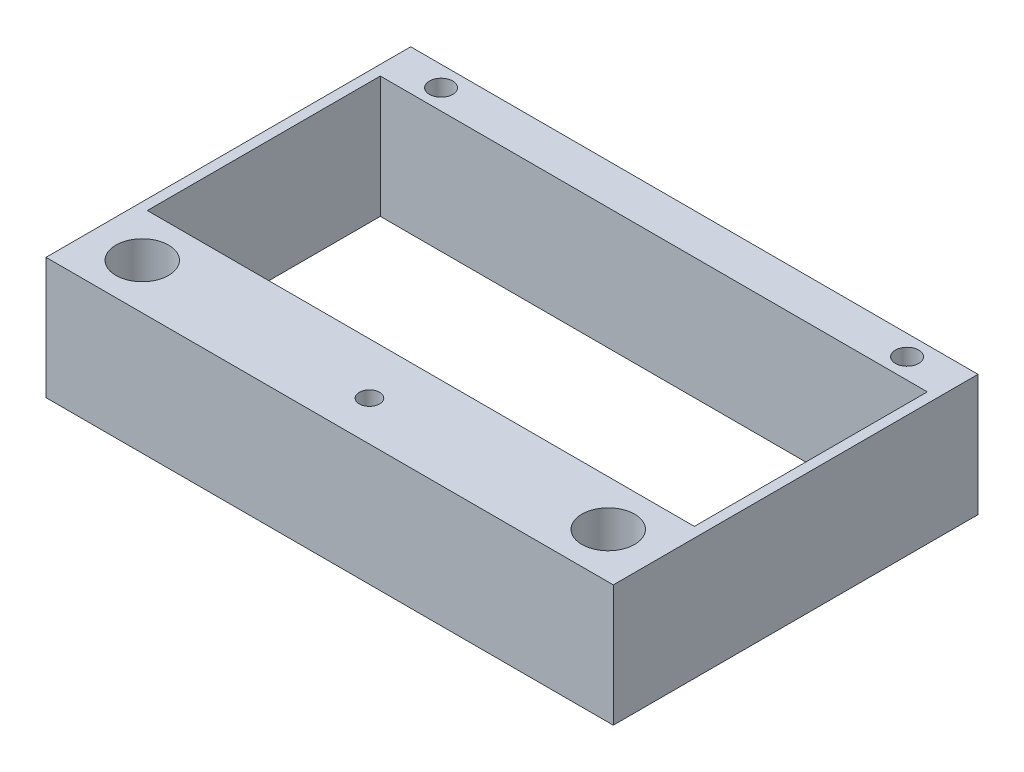
ISO-10303-21;
HEADER;
FILE_DESCRIPTION(('STEP AP214'),'2;1');
FILE_NAME('part.step','',(''),(''),'','','');
FILE_SCHEMA(('AUTOMOTIVE_DESIGN { 1 0 10303 214 1 1 1 1 }'));
ENDSEC;
DATA;
#1=APPLICATION_CONTEXT('core data for automotive mechanical design processes');
#2=APPLICATION_PROTOCOL_DEFINITION('international standard','automotive_design',2000,#1);
#3=PRODUCT_CONTEXT('',#1,'mechanical');
#4=PRODUCT('Part','Part','',(#3));
#5=PRODUCT_RELATED_PRODUCT_CATEGORY('part','',(#4));
#6=PRODUCT_DEFINITION_FORMATION('','',#4);
#7=PRODUCT_DEFINITION_CONTEXT('part definition',#1,'design');
#8=PRODUCT_DEFINITION('design','',#6,#7);
#9=PRODUCT_DEFINITION_SHAPE('','',#8);
#10=(LENGTH_UNIT() NAMED_UNIT(*) SI_UNIT(.MILLI.,.METRE.));
#11=(NAMED_UNIT(*) PLANE_ANGLE_UNIT() SI_UNIT($,.RADIAN.));
#12=(NAMED_UNIT(*) SI_UNIT($,.STERADIAN.) SOLID_ANGLE_UNIT());
#13=UNCERTAINTY_MEASURE_WITH_UNIT(LENGTH_MEASURE(1.E-05),#10,'distance_accuracy_value','');
#14=(GEOMETRIC_REPRESENTATION_CONTEXT(3) GLOBAL_UNCERTAINTY_ASSIGNED_CONTEXT((#13)) GLOBAL_UNIT_ASSIGNED_CONTEXT((#10,
#11,#12)) REPRESENTATION_CONTEXT('',''));
#15=CARTESIAN_POINT('',(0.,0.,0.));
#16=DIRECTION('',(0.,0.,1.));
#17=DIRECTION('',(1.,0.,0.));
#18=AXIS2_PLACEMENT_3D('',#15,#16,#17);
#19=CARTESIAN_POINT('',(0.,12.,0.));
#20=DIRECTION('',(0.,-1.,0.));
#21=DIRECTION('',(0.,0.,-1.));
#22=AXIS2_PLACEMENT_3D('',#19,#20,#21);
#23=PLANE('',#22);
#24=CARTESIAN_POINT('',(17.2743362831858,12.,19.1429731739301));
#25=DIRECTION('',(0.,1.,0.));
#26=DIRECTION('',(0.,0.,1.));
#27=AXIS2_PLACEMENT_3D('',#24,#25,#26);
#28=CIRCLE('',#27,1.);
#29=CARTESIAN_POINT('',(17.2743362831858,12.,20.1429731739301));
#30=VERTEX_POINT('',#29);
#31=EDGE_CURVE('E475',#30,#30,#28,.T.);
#32=ORIENTED_EDGE('',*,*,#31,.F.);
#33=EDGE_LOOP('',(#32));
#34=FACE_BOUND('',#33,.T.);
#35=CARTESIAN_POINT('',(40.2743362831859,12.,-10.929203539823));
#36=DIRECTION('',(0.,1.,0.));
#37=DIRECTION('',(0.,0.,1.));
#38=AXIS2_PLACEMENT_3D('',#35,#36,#37);
#39=CIRCLE('',#38,1.15);
#40=CARTESIAN_POINT('',(40.2743362831859,12.,-9.77920353982301));
#41=VERTEX_POINT('',#40);
#42=EDGE_CURVE('E449',#41,#41,#39,.T.);
#43=ORIENTED_EDGE('',*,*,#42,.F.);
#44=EDGE_LOOP('',(#43));
#45=FACE_BOUND('',#44,.T.);
#46=CARTESIAN_POINT('',(-5.72566371681537,12.,18.570796460177));
#47=DIRECTION('',(0.,1.,0.));
#48=DIRECTION('',(0.,0.,1.));
#49=AXIS2_PLACEMENT_3D('',#46,#47,#48);
#50=CIRCLE('',#49,2.6);
#51=CARTESIAN_POINT('',(-5.72566371681537,12.,21.170796460177));
#52=VERTEX_POINT('',#51);
#53=EDGE_CURVE('E460',#52,#52,#50,.T.);
#54=ORIENTED_EDGE('',*,*,#53,.F.);
#55=EDGE_LOOP('',(#54));
#56=FACE_BOUND('',#55,.T.);
#57=CARTESIAN_POINT('',(40.2743362831808,12.,18.570796460177));
#58=DIRECTION('',(0.,1.,0.));
#59=DIRECTION('',(0.,0.,1.));
#60=AXIS2_PLACEMENT_3D('',#57,#58,#59);
#61=CIRCLE('',#60,2.6);
#62=CARTESIAN_POINT('',(40.2743362831808,12.,21.170796460177));
#63=VERTEX_POINT('',#62);
#64=EDGE_CURVE('E461',#63,#63,#61,.T.);
#65=ORIENTED_EDGE('',*,*,#64,.F.);
#66=EDGE_LOOP('',(#65));
#67=FACE_BOUND('',#66,.T.);
#68=CARTESIAN_POINT('',(-5.72566371681414,12.,-10.929203539823));
#69=DIRECTION('',(0.,1.,0.));
#70=DIRECTION('',(0.,0.,1.));
#71=AXIS2_PLACEMENT_3D('',#68,#69,#70);
#72=CIRCLE('',#71,1.15);
#73=CARTESIAN_POINT('',(-5.72566371681414,12.,-9.77920353982301));
#74=VERTEX_POINT('',#73);
#75=EDGE_CURVE('E446',#74,#74,#72,.T.);
#76=ORIENTED_EDGE('',*,*,#75,.F.);
#77=EDGE_LOOP('',(#76));
#78=FACE_BOUND('',#77,.T.);
#79=DIRECTION('',(0.,0.,1.));
#80=VECTOR('',#79,1.);
#81=CARTESIAN_POINT('',(-10.7256637168141,12.,-1.92920353982301));
#82=LINE('',#81,#80);
#83=CARTESIAN_POINT('',(-10.7256637168141,12.,-12.929203539823));
#84=VERTEX_POINT('',#83);
#85=CARTESIAN_POINT('',(-10.7256637168142,12.,23.070796460177));
#86=VERTEX_POINT('',#85);
#87=EDGE_CURVE('E52',#84,#86,#82,.T.);
#88=ORIENTED_EDGE('',*,*,#87,.T.);
#89=DIRECTION('',(1.,0.,0.));
#90=VECTOR('',#89,1.);
#91=CARTESIAN_POINT('',(-10.7256637168142,12.,23.070796460177));
#92=LINE('',#91,#90);
#93=CARTESIAN_POINT('',(45.2743362831859,12.,23.070796460177));
#94=VERTEX_POINT('',#93);
#95=EDGE_CURVE('E132',#86,#94,#92,.T.);
#96=ORIENTED_EDGE('',*,*,#95,.T.);
#97=DIRECTION('',(0.,0.,-1.));
#98=VECTOR('',#97,1.);
#99=CARTESIAN_POINT('',(45.2743362831859,12.,-9.92920353982301));
#100=LINE('',#99,#98);
#101=CARTESIAN_POINT('',(45.2743362831859,12.,-12.929203539823));
#102=VERTEX_POINT('',#101);
#103=EDGE_CURVE('E11',#94,#102,#100,.T.);
#104=ORIENTED_EDGE('',*,*,#103,.T.);
#105=DIRECTION('',(-1.,0.,0.));
#106=VECTOR('',#105,1.);
#107=CARTESIAN_POINT('',(-10.7256637168141,12.,-12.929203539823));
#108=LINE('',#107,#106);
#109=EDGE_CURVE('E146',#102,#84,#108,.T.);
#110=ORIENTED_EDGE('',*,*,#109,.T.);
#111=EDGE_LOOP('',(#88,#96,#104,#110));
#112=FACE_BOUND('',#111,.T.);
#113=DIRECTION('',(1.,0.,0.));
#114=VECTOR('',#113,1.);
#115=CARTESIAN_POINT('',(-9.72566371681414,12.,14.070796460177));
#116=LINE('',#115,#114);
#117=CARTESIAN_POINT('',(-9.72566371681414,12.,14.070796460177));
#118=VERTEX_POINT('',#117);
#119=CARTESIAN_POINT('',(44.2743362831859,12.,14.070796460177));
#120=VERTEX_POINT('',#119);
#121=EDGE_CURVE('E159',#118,#120,#116,.T.);
#122=ORIENTED_EDGE('',*,*,#121,.F.);
#123=DIRECTION('',(0.,0.,1.));
#124=VECTOR('',#123,1.);
#125=CARTESIAN_POINT('',(-9.72566371681415,12.,-8.92920353982301));
#126=LINE('',#125,#124);
#127=CARTESIAN_POINT('',(-9.72566371681418,12.,-8.92920353982301));
#128=VERTEX_POINT('',#127);
#129=EDGE_CURVE('E169',#128,#118,#126,.T.);
#130=ORIENTED_EDGE('',*,*,#129,.F.);
#131=DIRECTION('',(-1.,0.,0.));
#132=VECTOR('',#131,1.);
#133=CARTESIAN_POINT('',(44.2743362831858,12.,-8.92920353982301));
#134=LINE('',#133,#132);
#135=CARTESIAN_POINT('',(44.2743362831858,12.,-8.92920353982301));
#136=VERTEX_POINT('',#135);
#137=EDGE_CURVE('E166',#136,#128,#134,.T.);
#138=ORIENTED_EDGE('',*,*,#137,.F.);
#139=DIRECTION('',(0.,0.,-1.));
#140=VECTOR('',#139,1.);
#141=CARTESIAN_POINT('',(44.2743362831859,12.,14.070796460177));
#142=LINE('',#141,#140);
#143=EDGE_CURVE('E162',#120,#136,#142,.T.);
#144=ORIENTED_EDGE('',*,*,#143,.F.);
#145=EDGE_LOOP('',(#122,#130,#138,#144));
#146=FACE_BOUND('',#145,.T.);
#147=ADVANCED_FACE('F42',(#34,#45,#56,#67,#78,#112,#146),#23,.F.);
#148=CARTESIAN_POINT('',(0.,0.,0.));
#149=DIRECTION('',(0.,-1.,0.));
#150=DIRECTION('',(0.,0.,-1.));
#151=AXIS2_PLACEMENT_3D('',#148,#149,#150);
#152=PLANE('',#151);
#153=CARTESIAN_POINT('',(40.2743362831859,0.,-10.929203539823));
#154=DIRECTION('',(0.,1.,0.));
#155=DIRECTION('',(0.,0.,1.));
#156=AXIS2_PLACEMENT_3D('',#153,#154,#155);
#157=CIRCLE('',#156,1.15);
#158=CARTESIAN_POINT('',(40.2743362831859,0.,-9.77920353982301));
#159=VERTEX_POINT('',#158);
#160=EDGE_CURVE('E454',#159,#159,#157,.T.);
#161=ORIENTED_EDGE('',*,*,#160,.T.);
#162=EDGE_LOOP('',(#161));
#163=FACE_BOUND('',#162,.T.);
#164=CARTESIAN_POINT('',(-5.72566371681537,0.,18.570796460177));
#165=DIRECTION('',(0.,1.,0.));
#166=DIRECTION('',(0.,0.,1.));
#167=AXIS2_PLACEMENT_3D('',#164,#165,#166);
#168=CIRCLE('',#167,2.6);
#169=CARTESIAN_POINT('',(-5.72566371681537,0.,21.170796460177));
#170=VERTEX_POINT('',#169);
#171=EDGE_CURVE('E457',#170,#170,#168,.T.);
#172=ORIENTED_EDGE('',*,*,#171,.T.);
#173=EDGE_LOOP('',(#172));
#174=FACE_BOUND('',#173,.T.);
#175=CARTESIAN_POINT('',(40.2743362831808,0.,18.570796460177));
#176=DIRECTION('',(0.,1.,0.));
#177=DIRECTION('',(0.,0.,1.));
#178=AXIS2_PLACEMENT_3D('',#175,#176,#177);
#179=CIRCLE('',#178,2.6);
#180=CARTESIAN_POINT('',(40.2743362831808,0.,21.170796460177));
#181=VERTEX_POINT('',#180);
#182=EDGE_CURVE('E468',#181,#181,#179,.T.);
#183=ORIENTED_EDGE('',*,*,#182,.T.);
#184=EDGE_LOOP('',(#183));
#185=FACE_BOUND('',#184,.T.);
#186=CARTESIAN_POINT('',(-5.72566371681414,0.,-10.929203539823));
#187=DIRECTION('',(0.,1.,0.));
#188=DIRECTION('',(0.,0.,1.));
#189=AXIS2_PLACEMENT_3D('',#186,#187,#188);
#190=CIRCLE('',#189,1.15);
#191=CARTESIAN_POINT('',(-5.72566371681414,0.,-9.77920353982301));
#192=VERTEX_POINT('',#191);
#193=EDGE_CURVE('E142',#192,#192,#190,.T.);
#194=ORIENTED_EDGE('',*,*,#193,.T.);
#195=EDGE_LOOP('',(#194));
#196=FACE_BOUND('',#195,.T.);
#197=DIRECTION('',(0.,0.,1.));
#198=VECTOR('',#197,1.);
#199=CARTESIAN_POINT('',(-10.7256637168142,0.,22.070796460177));
#200=LINE('',#199,#198);
#201=CARTESIAN_POINT('',(-10.7256637168141,0.,-12.929203539823));
#202=VERTEX_POINT('',#201);
#203=CARTESIAN_POINT('',(-10.7256637168142,0.,23.070796460177));
#204=VERTEX_POINT('',#203);
#205=EDGE_CURVE('E123',#202,#204,#200,.T.);
#206=ORIENTED_EDGE('',*,*,#205,.F.);
#207=DIRECTION('',(-1.,0.,0.));
#208=VECTOR('',#207,1.);
#209=CARTESIAN_POINT('',(-10.7256637168141,0.,-12.929203539823));
#210=LINE('',#209,#208);
#211=CARTESIAN_POINT('',(45.2743362831859,0.,-12.929203539823));
#212=VERTEX_POINT('',#211);
#213=EDGE_CURVE('E117',#212,#202,#210,.T.);
#214=ORIENTED_EDGE('',*,*,#213,.F.);
#215=DIRECTION('',(0.,0.,-1.));
#216=VECTOR('',#215,1.);
#217=CARTESIAN_POINT('',(45.2743362831859,0.,-9.92920353982301));
#218=LINE('',#217,#216);
#219=CARTESIAN_POINT('',(45.2743362831859,0.,23.070796460177));
#220=VERTEX_POINT('',#219);
#221=EDGE_CURVE('E46',#220,#212,#218,.T.);
#222=ORIENTED_EDGE('',*,*,#221,.F.);
#223=DIRECTION('',(1.,0.,0.));
#224=VECTOR('',#223,1.);
#225=CARTESIAN_POINT('',(-10.7256637168142,0.,23.070796460177));
#226=LINE('',#225,#224);
#227=EDGE_CURVE('E114',#204,#220,#226,.T.);
#228=ORIENTED_EDGE('',*,*,#227,.F.);
#229=EDGE_LOOP('',(#206,#214,#222,#228));
#230=FACE_BOUND('',#229,.T.);
#231=DIRECTION('',(0.,0.,1.));
#232=VECTOR('',#231,1.);
#233=CARTESIAN_POINT('',(-9.72566371681415,0.,7.070796460177));
#234=LINE('',#233,#232);
#235=CARTESIAN_POINT('',(-9.72566371681415,0.,-8.92920353982301));
#236=VERTEX_POINT('',#235);
#237=CARTESIAN_POINT('',(-9.72566371681414,0.,14.070796460177));
#238=VERTEX_POINT('',#237);
#239=EDGE_CURVE('E163',#236,#238,#234,.T.);
#240=ORIENTED_EDGE('',*,*,#239,.T.);
#241=DIRECTION('',(1.,0.,0.));
#242=VECTOR('',#241,1.);
#243=CARTESIAN_POINT('',(-9.72566371681414,0.,14.070796460177));
#244=LINE('',#243,#242);
#245=CARTESIAN_POINT('',(44.2743362831859,0.,14.070796460177));
#246=VERTEX_POINT('',#245);
#247=EDGE_CURVE('E68',#238,#246,#244,.T.);
#248=ORIENTED_EDGE('',*,*,#247,.T.);
#249=DIRECTION('',(0.,0.,-1.));
#250=VECTOR('',#249,1.);
#251=CARTESIAN_POINT('',(44.2743362831859,0.,14.070796460177));
#252=LINE('',#251,#250);
#253=CARTESIAN_POINT('',(44.2743362831858,0.,-8.92920353982301));
#254=VERTEX_POINT('',#253);
#255=EDGE_CURVE('E175',#246,#254,#252,.T.);
#256=ORIENTED_EDGE('',*,*,#255,.T.);
#257=DIRECTION('',(-1.,0.,0.));
#258=VECTOR('',#257,1.);
#259=CARTESIAN_POINT('',(44.2743362831858,0.,-8.92920353982301));
#260=LINE('',#259,#258);
#261=EDGE_CURVE('E179',#254,#236,#260,.T.);
#262=ORIENTED_EDGE('',*,*,#261,.T.);
#263=EDGE_LOOP('',(#240,#248,#256,#262));
#264=FACE_BOUND('',#263,.T.);
#265=ADVANCED_FACE('F112',(#163,#174,#185,#196,#230,#264),#152,.T.);
#266=CARTESIAN_POINT('',(-10.7256637168142,12.,22.070796460177));
#267=DIRECTION('',(1.,0.,0.));
#268=DIRECTION('',(0.,0.,-1.));
#269=AXIS2_PLACEMENT_3D('',#266,#267,#268);
#270=PLANE('',#269);
#271=ORIENTED_EDGE('',*,*,#205,.T.);
#272=DIRECTION('',(0.,-1.,0.));
#273=VECTOR('',#272,1.);
#274=CARTESIAN_POINT('',(-10.7256637168142,12.,23.070796460177));
#275=LINE('',#274,#273);
#276=EDGE_CURVE('E130',#86,#204,#275,.T.);
#277=ORIENTED_EDGE('',*,*,#276,.F.);
#278=ORIENTED_EDGE('',*,*,#87,.F.);
#279=DIRECTION('',(0.,-1.,0.));
#280=VECTOR('',#279,1.);
#281=CARTESIAN_POINT('',(-10.7256637168141,12.,-12.929203539823));
#282=LINE('',#281,#280);
#283=EDGE_CURVE('E150',#84,#202,#282,.T.);
#284=ORIENTED_EDGE('',*,*,#283,.T.);
#285=EDGE_LOOP('',(#271,#277,#278,#284));
#286=FACE_BOUND('',#285,.T.);
#287=ADVANCED_FACE('F44',(#286),#270,.F.);
#288=CARTESIAN_POINT('',(45.2743362831859,12.,-9.92920353982301));
#289=DIRECTION('',(-1.,0.,0.));
#290=DIRECTION('',(0.,0.,1.));
#291=AXIS2_PLACEMENT_3D('',#288,#289,#290);
#292=PLANE('',#291);
#293=ORIENTED_EDGE('',*,*,#221,.T.);
#294=DIRECTION('',(0.,-1.,0.));
#295=VECTOR('',#294,1.);
#296=CARTESIAN_POINT('',(45.2743362831859,12.,-12.929203539823));
#297=LINE('',#296,#295);
#298=EDGE_CURVE('E156',#102,#212,#297,.T.);
#299=ORIENTED_EDGE('',*,*,#298,.F.);
#300=ORIENTED_EDGE('',*,*,#103,.F.);
#301=DIRECTION('',(0.,-1.,0.));
#302=VECTOR('',#301,1.);
#303=CARTESIAN_POINT('',(45.2743362831859,12.,23.070796460177));
#304=LINE('',#303,#302);
#305=EDGE_CURVE('E128',#94,#220,#304,.T.);
#306=ORIENTED_EDGE('',*,*,#305,.T.);
#307=EDGE_LOOP('',(#293,#299,#300,#306));
#308=FACE_BOUND('',#307,.T.);
#309=ADVANCED_FACE('F134',(#308),#292,.F.);
#310=CARTESIAN_POINT('',(-9.72566371681414,12.,14.070796460177));
#311=DIRECTION('',(0.,0.,-1.));
#312=DIRECTION('',(-1.,0.,0.));
#313=AXIS2_PLACEMENT_3D('',#310,#311,#312);
#314=PLANE('',#313);
#315=ORIENTED_EDGE('',*,*,#247,.F.);
#316=DIRECTION('',(0.,-1.,0.));
#317=VECTOR('',#316,1.);
#318=CARTESIAN_POINT('',(-9.72566371681414,12.,14.070796460177));
#319=LINE('',#318,#317);
#320=EDGE_CURVE('E172',#118,#238,#319,.T.);
#321=ORIENTED_EDGE('',*,*,#320,.F.);
#322=ORIENTED_EDGE('',*,*,#121,.T.);
#323=DIRECTION('',(0.,-1.,0.));
#324=VECTOR('',#323,1.);
#325=CARTESIAN_POINT('',(44.2743362831859,12.,14.070796460177));
#326=LINE('',#325,#324);
#327=EDGE_CURVE('E193',#120,#246,#326,.T.);
#328=ORIENTED_EDGE('',*,*,#327,.T.);
#329=EDGE_LOOP('',(#315,#321,#322,#328));
#330=FACE_BOUND('',#329,.T.);
#331=ADVANCED_FACE('F214',(#330),#314,.T.);
#332=CARTESIAN_POINT('',(44.2743362831859,12.,14.070796460177));
#333=DIRECTION('',(-1.,0.,0.));
#334=DIRECTION('',(0.,0.,1.));
#335=AXIS2_PLACEMENT_3D('',#332,#333,#334);
#336=PLANE('',#335);
#337=ORIENTED_EDGE('',*,*,#255,.F.);
#338=ORIENTED_EDGE('',*,*,#327,.F.);
#339=ORIENTED_EDGE('',*,*,#143,.T.);
#340=DIRECTION('',(0.,-1.,0.));
#341=VECTOR('',#340,1.);
#342=CARTESIAN_POINT('',(44.2743362831858,12.,-8.92920353982301));
#343=LINE('',#342,#341);
#344=EDGE_CURVE('E190',#136,#254,#343,.T.);
#345=ORIENTED_EDGE('',*,*,#344,.T.);
#346=EDGE_LOOP('',(#337,#338,#339,#345));
#347=FACE_BOUND('',#346,.T.);
#348=ADVANCED_FACE('F216',(#347),#336,.T.);
#349=CARTESIAN_POINT('',(44.2743362831858,12.,-8.92920353982301));
#350=DIRECTION('',(0.,0.,1.));
#351=DIRECTION('',(1.,0.,0.));
#352=AXIS2_PLACEMENT_3D('',#349,#350,#351);
#353=PLANE('',#352);
#354=ORIENTED_EDGE('',*,*,#261,.F.);
#355=ORIENTED_EDGE('',*,*,#344,.F.);
#356=ORIENTED_EDGE('',*,*,#137,.T.);
#357=DIRECTION('',(0.,-1.,0.));
#358=VECTOR('',#357,1.);
#359=CARTESIAN_POINT('',(-9.72566371681415,12.,-8.92920353982301));
#360=LINE('',#359,#358);
#361=EDGE_CURVE('E60',#128,#236,#360,.T.);
#362=ORIENTED_EDGE('',*,*,#361,.T.);
#363=EDGE_LOOP('',(#354,#355,#356,#362));
#364=FACE_BOUND('',#363,.T.);
#365=ADVANCED_FACE('F221',(#364),#353,.T.);
#366=CARTESIAN_POINT('',(-9.72566371681415,12.,7.070796460177));
#367=DIRECTION('',(1.,0.,0.));
#368=DIRECTION('',(0.,0.,-1.));
#369=AXIS2_PLACEMENT_3D('',#366,#367,#368);
#370=PLANE('',#369);
#371=ORIENTED_EDGE('',*,*,#239,.F.);
#372=ORIENTED_EDGE('',*,*,#361,.F.);
#373=ORIENTED_EDGE('',*,*,#129,.T.);
#374=ORIENTED_EDGE('',*,*,#320,.T.);
#375=EDGE_LOOP('',(#371,#372,#373,#374));
#376=FACE_BOUND('',#375,.T.);
#377=ADVANCED_FACE('F219',(#376),#370,.T.);
#378=CARTESIAN_POINT('',(-10.7256637168141,12.,-12.929203539823));
#379=DIRECTION('',(0.,0.,1.));
#380=DIRECTION('',(1.,0.,0.));
#381=AXIS2_PLACEMENT_3D('',#378,#379,#380);
#382=PLANE('',#381);
#383=ORIENTED_EDGE('',*,*,#213,.T.);
#384=ORIENTED_EDGE('',*,*,#283,.F.);
#385=ORIENTED_EDGE('',*,*,#109,.F.);
#386=ORIENTED_EDGE('',*,*,#298,.T.);
#387=EDGE_LOOP('',(#383,#384,#385,#386));
#388=FACE_BOUND('',#387,.T.);
#389=ADVANCED_FACE('F202',(#388),#382,.F.);
#390=CARTESIAN_POINT('',(-10.7256637168142,12.,23.070796460177));
#391=DIRECTION('',(0.,0.,-1.));
#392=DIRECTION('',(-1.,0.,0.));
#393=AXIS2_PLACEMENT_3D('',#390,#391,#392);
#394=PLANE('',#393);
#395=ORIENTED_EDGE('',*,*,#227,.T.);
#396=ORIENTED_EDGE('',*,*,#305,.F.);
#397=ORIENTED_EDGE('',*,*,#95,.F.);
#398=ORIENTED_EDGE('',*,*,#276,.T.);
#399=EDGE_LOOP('',(#395,#396,#397,#398));
#400=FACE_BOUND('',#399,.T.);
#401=ADVANCED_FACE('F126',(#400),#394,.F.);
#402=CARTESIAN_POINT('',(-5.72566371681414,0.,-10.929203539823));
#403=DIRECTION('',(0.,1.,0.));
#404=DIRECTION('',(0.,0.,1.));
#405=AXIS2_PLACEMENT_3D('',#402,#403,#404);
#406=CYLINDRICAL_SURFACE('',#405,1.15);
#407=ORIENTED_EDGE('',*,*,#193,.F.);
#408=EDGE_LOOP('',(#407));
#409=FACE_BOUND('',#408,.T.);
#410=ORIENTED_EDGE('',*,*,#75,.T.);
#411=EDGE_LOOP('',(#410));
#412=FACE_BOUND('',#411,.T.);
#413=ADVANCED_FACE('F303',(#409,#412),#406,.F.);
#414=CARTESIAN_POINT('',(40.2743362831808,0.,18.570796460177));
#415=DIRECTION('',(0.,1.,0.));
#416=DIRECTION('',(0.,0.,1.));
#417=AXIS2_PLACEMENT_3D('',#414,#415,#416);
#418=CYLINDRICAL_SURFACE('',#417,2.6);
#419=ORIENTED_EDGE('',*,*,#182,.F.);
#420=EDGE_LOOP('',(#419));
#421=FACE_BOUND('',#420,.T.);
#422=ORIENTED_EDGE('',*,*,#64,.T.);
#423=EDGE_LOOP('',(#422));
#424=FACE_BOUND('',#423,.T.);
#425=ADVANCED_FACE('F294',(#421,#424),#418,.F.);
#426=CARTESIAN_POINT('',(-5.72566371681537,0.,18.570796460177));
#427=DIRECTION('',(0.,1.,0.));
#428=DIRECTION('',(0.,0.,1.));
#429=AXIS2_PLACEMENT_3D('',#426,#427,#428);
#430=CYLINDRICAL_SURFACE('',#429,2.6);
#431=ORIENTED_EDGE('',*,*,#171,.F.);
#432=EDGE_LOOP('',(#431));
#433=FACE_BOUND('',#432,.T.);
#434=ORIENTED_EDGE('',*,*,#53,.T.);
#435=EDGE_LOOP('',(#434));
#436=FACE_BOUND('',#435,.T.);
#437=ADVANCED_FACE('F285',(#433,#436),#430,.F.);
#438=CARTESIAN_POINT('',(40.2743362831859,0.,-10.929203539823));
#439=DIRECTION('',(0.,1.,0.));
#440=DIRECTION('',(0.,0.,1.));
#441=AXIS2_PLACEMENT_3D('',#438,#439,#440);
#442=CYLINDRICAL_SURFACE('',#441,1.15);
#443=ORIENTED_EDGE('',*,*,#160,.F.);
#444=EDGE_LOOP('',(#443));
#445=FACE_BOUND('',#444,.T.);
#446=ORIENTED_EDGE('',*,*,#42,.T.);
#447=EDGE_LOOP('',(#446));
#448=FACE_BOUND('',#447,.T.);
#449=ADVANCED_FACE('F253',(#445,#448),#442,.F.);
#450=CARTESIAN_POINT('',(17.2743362831858,2.,19.1429731739301));
#451=DIRECTION('',(0.,1.,0.));
#452=DIRECTION('',(0.,0.,1.));
#453=AXIS2_PLACEMENT_3D('',#450,#451,#452);
#454=CYLINDRICAL_SURFACE('',#453,1.);
#455=CARTESIAN_POINT('',(17.2743362831858,2.,19.1429731739301));
#456=DIRECTION('',(0.,1.,0.));
#457=DIRECTION('',(0.,0.,1.));
#458=AXIS2_PLACEMENT_3D('',#455,#456,#457);
#459=CIRCLE('',#458,1.);
#460=CARTESIAN_POINT('',(17.2743362831858,2.,20.1429731739301));
#461=VERTEX_POINT('',#460);
#462=EDGE_CURVE('E471',#461,#461,#459,.T.);
#463=ORIENTED_EDGE('',*,*,#462,.F.);
#464=EDGE_LOOP('',(#463));
#465=FACE_BOUND('',#464,.T.);
#466=ORIENTED_EDGE('',*,*,#31,.T.);
#467=EDGE_LOOP('',(#466));
#468=FACE_BOUND('',#467,.T.);
#469=ADVANCED_FACE('F258',(#465,#468),#454,.F.);
#470=CARTESIAN_POINT('',(17.2743362831858,2.,19.1429731739301));
#471=DIRECTION('',(0.,1.,0.));
#472=DIRECTION('',(0.,0.,1.));
#473=AXIS2_PLACEMENT_3D('',#470,#471,#472);
#474=PLANE('',#473);
#475=ORIENTED_EDGE('',*,*,#462,.T.);
#476=EDGE_LOOP('',(#475));
#477=FACE_BOUND('',#476,.T.);
#478=ADVANCED_FACE('F263',(#477),#474,.T.);
#479=CLOSED_SHELL('',(#147,#265,#287,#309,#331,#348,#365,#377,#389,#401,#413,#425,#437,#449,
#469,#478));
#480=MANIFOLD_SOLID_BREP('B2',#479);
#481=ADVANCED_BREP_SHAPE_REPRESENTATION('',(#18,#480),#14);
#482=SHAPE_DEFINITION_REPRESENTATION(#9,#481);
ENDSEC;
END-ISO-10303-21;
